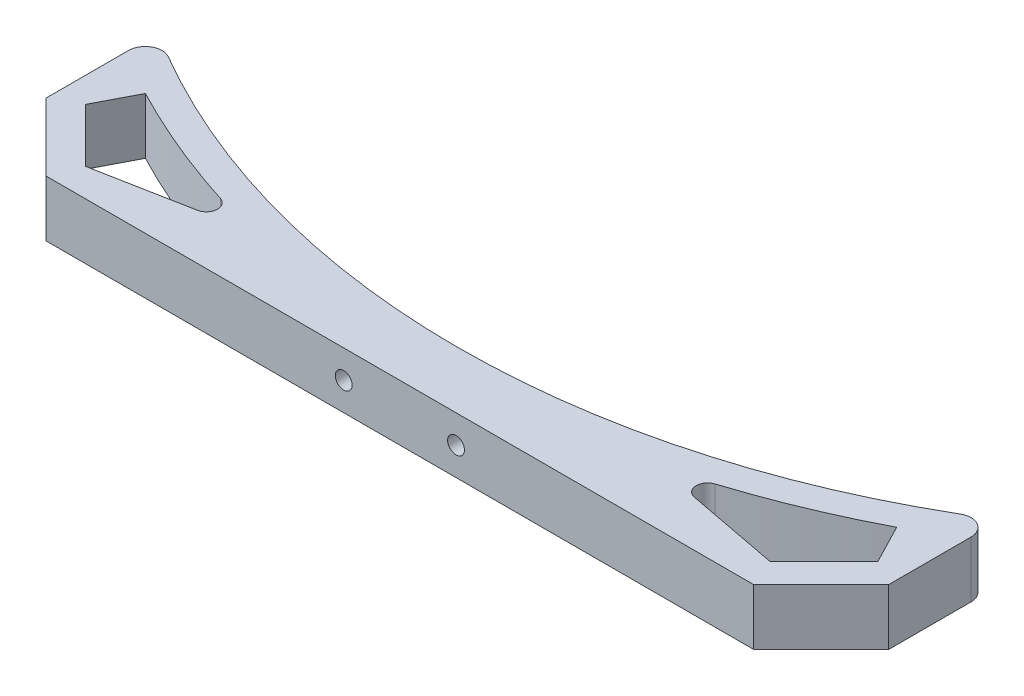
ISO-10303-21;
HEADER;
FILE_DESCRIPTION(('STEP AP214'),'2;1');
FILE_NAME('part.step','',(''),(''),'','','');
FILE_SCHEMA(('AUTOMOTIVE_DESIGN { 1 0 10303 214 1 1 1 1 }'));
ENDSEC;
DATA;
#1=APPLICATION_CONTEXT('core data for automotive mechanical design processes');
#2=APPLICATION_PROTOCOL_DEFINITION('international standard','automotive_design',2000,#1);
#3=PRODUCT_CONTEXT('',#1,'mechanical');
#4=PRODUCT('Part','Part','',(#3));
#5=PRODUCT_RELATED_PRODUCT_CATEGORY('part','',(#4));
#6=PRODUCT_DEFINITION_FORMATION('','',#4);
#7=PRODUCT_DEFINITION_CONTEXT('part definition',#1,'design');
#8=PRODUCT_DEFINITION('design','',#6,#7);
#9=PRODUCT_DEFINITION_SHAPE('','',#8);
#10=(LENGTH_UNIT() NAMED_UNIT(*) SI_UNIT(.MILLI.,.METRE.));
#11=(NAMED_UNIT(*) PLANE_ANGLE_UNIT() SI_UNIT($,.RADIAN.));
#12=(NAMED_UNIT(*) SI_UNIT($,.STERADIAN.) SOLID_ANGLE_UNIT());
#13=UNCERTAINTY_MEASURE_WITH_UNIT(LENGTH_MEASURE(1.E-05),#10,'distance_accuracy_value','');
#14=(GEOMETRIC_REPRESENTATION_CONTEXT(3) GLOBAL_UNCERTAINTY_ASSIGNED_CONTEXT((#13)) GLOBAL_UNIT_ASSIGNED_CONTEXT((#10,
#11,#12)) REPRESENTATION_CONTEXT('',''));
#15=CARTESIAN_POINT('',(0.,0.,0.));
#16=DIRECTION('',(0.,0.,1.));
#17=DIRECTION('',(1.,0.,0.));
#18=AXIS2_PLACEMENT_3D('',#15,#16,#17);
#19=CARTESIAN_POINT('',(0.,10.,-135.715904175369));
#20=DIRECTION('',(0.,1.,0.));
#21=DIRECTION('',(0.,0.,1.));
#22=AXIS2_PLACEMENT_3D('',#19,#20,#21);
#23=PLANE('',#22);
#24=DIRECTION('',(1.,0.,0.));
#25=VECTOR('',#24,1.);
#26=CARTESIAN_POINT('',(-75.,10.,14.51));
#27=LINE('',#26,#25);
#28=CARTESIAN_POINT('',(-62.99,10.,14.51));
#29=VERTEX_POINT('',#28);
#30=CARTESIAN_POINT('',(62.9899999999999,10.,14.51));
#31=VERTEX_POINT('',#30);
#32=EDGE_CURVE('E162',#29,#31,#27,.T.);
#33=ORIENTED_EDGE('',*,*,#32,.T.);
#34=DIRECTION('',(-0.707106781186549,0.,0.707106781186546));
#35=VECTOR('',#34,1.);
#36=CARTESIAN_POINT('',(106.607952087684,10.,-29.1079520876842));
#37=LINE('',#36,#35);
#38=CARTESIAN_POINT('',(75.,10.,2.49999999999994));
#39=VERTEX_POINT('',#38);
#40=EDGE_CURVE('E185',#31,#39,#37,.F.);
#41=ORIENTED_EDGE('',*,*,#40,.T.);
#42=DIRECTION('',(0.,0.,-1.));
#43=VECTOR('',#42,1.);
#44=CARTESIAN_POINT('',(75.,10.,17.5));
#45=LINE('',#44,#43);
#46=CARTESIAN_POINT('',(75.,10.,-12.16429552538));
#47=VERTEX_POINT('',#46);
#48=EDGE_CURVE('E187',#39,#47,#45,.T.);
#49=ORIENTED_EDGE('',*,*,#48,.T.);
#50=CARTESIAN_POINT('',(72.,10.,-12.16429552538));
#51=DIRECTION('',(0.,1.,0.));
#52=DIRECTION('',(0.,0.,1.));
#53=AXIS2_PLACEMENT_3D('',#50,#51,#52);
#54=CIRCLE('',#53,3.);
#55=CARTESIAN_POINT('',(70.4895104895105,10.,-14.7562873152399));
#56=VERTEX_POINT('',#55);
#57=EDGE_CURVE('E210',#47,#56,#54,.T.);
#58=ORIENTED_EDGE('',*,*,#57,.T.);
#59=CARTESIAN_POINT('',(0.,10.,-135.715904175369));
#60=DIRECTION('',(0.,-1.,0.));
#61=DIRECTION('',(0.,0.,1.));
#62=AXIS2_PLACEMENT_3D('',#59,#60,#61);
#63=CIRCLE('',#62,140.);
#64=CARTESIAN_POINT('',(-70.4895104895105,10.,-14.7562873152399));
#65=VERTEX_POINT('',#64);
#66=EDGE_CURVE('E274',#56,#65,#63,.T.);
#67=ORIENTED_EDGE('',*,*,#66,.T.);
#68=CARTESIAN_POINT('',(-72.,10.,-12.16429552538));
#69=DIRECTION('',(0.,1.,0.));
#70=DIRECTION('',(0.,0.,1.));
#71=AXIS2_PLACEMENT_3D('',#68,#69,#70);
#72=CIRCLE('',#71,3.);
#73=CARTESIAN_POINT('',(-75.,10.,-12.16429552538));
#74=VERTEX_POINT('',#73);
#75=EDGE_CURVE('E208',#65,#74,#72,.T.);
#76=ORIENTED_EDGE('',*,*,#75,.T.);
#77=DIRECTION('',(0.,0.,1.));
#78=VECTOR('',#77,1.);
#79=CARTESIAN_POINT('',(-75.,10.,17.5));
#80=LINE('',#79,#78);
#81=CARTESIAN_POINT('',(-75.,10.,2.49999999999994));
#82=VERTEX_POINT('',#81);
#83=EDGE_CURVE('E272',#74,#82,#80,.T.);
#84=ORIENTED_EDGE('',*,*,#83,.T.);
#85=DIRECTION('',(-0.707106781186546,0.,-0.707106781186549));
#86=VECTOR('',#85,1.);
#87=CARTESIAN_POINT('',(-106.607952087685,10.,-29.1079520876848));
#88=LINE('',#87,#86);
#89=EDGE_CURVE('E192',#82,#29,#88,.F.);
#90=ORIENTED_EDGE('',*,*,#89,.T.);
#91=EDGE_LOOP('',(#33,#41,#49,#58,#67,#76,#84,#90));
#92=FACE_BOUND('',#91,.T.);
#93=DIRECTION('',(0.461170886554333,0.,-0.88731133960673));
#94=VECTOR('',#93,1.);
#95=CARTESIAN_POINT('',(-55.535240746244,10.,-28.8638666798792));
#96=LINE('',#95,#94);
#97=CARTESIAN_POINT('',(-70.5,10.,-0.0710678118655203));
#98=VERTEX_POINT('',#97);
#99=CARTESIAN_POINT('',(-66.8697785503785,10.,-7.05575993239305));
#100=VERTEX_POINT('',#99);
#101=EDGE_CURVE('E334',#98,#100,#96,.T.);
#102=ORIENTED_EDGE('',*,*,#101,.T.);
#103=CARTESIAN_POINT('',(0.,10.,-135.715904175369));
#104=DIRECTION('',(0.,-1.,0.));
#105=DIRECTION('',(0.,0.,-1.));
#106=AXIS2_PLACEMENT_3D('',#103,#104,#105);
#107=CIRCLE('',#106,145.);
#108=CARTESIAN_POINT('',(-44.0052899238032,10.,2.44535833595166));
#109=VERTEX_POINT('',#108);
#110=EDGE_CURVE('E341',#109,#100,#107,.T.);
#111=ORIENTED_EDGE('',*,*,#110,.F.);
#112=CARTESIAN_POINT('',(-44.6122594399936,10.,4.35103092231472));
#113=DIRECTION('',(0.,1.,0.));
#114=DIRECTION('',(0.,0.,1.));
#115=AXIS2_PLACEMENT_3D('',#112,#113,#114);
#116=CIRCLE('',#115,2.);
#117=CARTESIAN_POINT('',(-44.2374589946152,10.,6.31559820956758));
#118=VERTEX_POINT('',#117);
#119=EDGE_CURVE('E11',#109,#118,#116,.F.);
#120=ORIENTED_EDGE('',*,*,#119,.T.);
#121=DIRECTION('',(0.98228364362644,0.,-0.187400222689211));
#122=VECTOR('',#121,1.);
#123=CARTESIAN_POINT('',(-0.390991983125823,10.,-2.04943742489839));
#124=LINE('',#123,#122);
#125=CARTESIAN_POINT('',(-60.9289321881345,10.,9.49999999999999));
#126=VERTEX_POINT('',#125);
#127=EDGE_CURVE('E354',#126,#118,#124,.T.);
#128=ORIENTED_EDGE('',*,*,#127,.F.);
#129=DIRECTION('',(-0.707106781186546,0.,-0.707106781186549));
#130=VECTOR('',#129,1.);
#131=CARTESIAN_POINT('',(-35.2144660940673,10.,35.2144660940672));
#132=LINE('',#131,#130);
#133=EDGE_CURVE('E351',#126,#98,#132,.T.);
#134=ORIENTED_EDGE('',*,*,#133,.T.);
#135=EDGE_LOOP('',(#102,#111,#120,#128,#134));
#136=FACE_BOUND('',#135,.T.);
#137=DIRECTION('',(-0.98228364362644,0.,-0.187400222689211));
#138=VECTOR('',#137,1.);
#139=CARTESIAN_POINT('',(0.390991983125823,10.,-2.04943742489839));
#140=LINE('',#139,#138);
#141=CARTESIAN_POINT('',(60.9289321881345,10.,9.5));
#142=VERTEX_POINT('',#141);
#143=CARTESIAN_POINT('',(44.2374589946152,10.,6.31559820956757));
#144=VERTEX_POINT('',#143);
#145=EDGE_CURVE('E315',#142,#144,#140,.T.);
#146=ORIENTED_EDGE('',*,*,#145,.T.);
#147=CARTESIAN_POINT('',(44.6122594399936,10.,4.35103092231472));
#148=DIRECTION('',(0.,1.,0.));
#149=DIRECTION('',(0.,0.,1.));
#150=AXIS2_PLACEMENT_3D('',#147,#148,#149);
#151=CIRCLE('',#150,2.);
#152=CARTESIAN_POINT('',(44.0052899238032,10.,2.44535833595166));
#153=VERTEX_POINT('',#152);
#154=EDGE_CURVE('E442',#144,#153,#151,.F.);
#155=ORIENTED_EDGE('',*,*,#154,.T.);
#156=CARTESIAN_POINT('',(0.,10.,-135.715904175369));
#157=DIRECTION('',(0.,-1.,0.));
#158=DIRECTION('',(0.,0.,-1.));
#159=AXIS2_PLACEMENT_3D('',#156,#157,#158);
#160=CIRCLE('',#159,145.);
#161=CARTESIAN_POINT('',(66.8697785503785,10.,-7.05575993239305));
#162=VERTEX_POINT('',#161);
#163=EDGE_CURVE('E327',#153,#162,#160,.F.);
#164=ORIENTED_EDGE('',*,*,#163,.T.);
#165=DIRECTION('',(-0.461170886554333,0.,-0.88731133960673));
#166=VECTOR('',#165,1.);
#167=CARTESIAN_POINT('',(55.535240746244,10.,-28.8638666798792));
#168=LINE('',#167,#166);
#169=CARTESIAN_POINT('',(70.5,10.,-0.0710678118655203));
#170=VERTEX_POINT('',#169);
#171=EDGE_CURVE('E324',#170,#162,#168,.T.);
#172=ORIENTED_EDGE('',*,*,#171,.F.);
#173=DIRECTION('',(0.707106781186546,0.,-0.707106781186549));
#174=VECTOR('',#173,1.);
#175=CARTESIAN_POINT('',(35.2144660940673,10.,35.2144660940672));
#176=LINE('',#175,#174);
#177=EDGE_CURVE('E307',#142,#170,#176,.T.);
#178=ORIENTED_EDGE('',*,*,#177,.F.);
#179=EDGE_LOOP('',(#146,#155,#164,#172,#178));
#180=FACE_BOUND('',#179,.T.);
#181=ADVANCED_FACE('F34',(#92,#136,#180),#23,.T.);
#182=CARTESIAN_POINT('',(0.,0.,-135.715904175369));
#183=DIRECTION('',(0.,1.,0.));
#184=DIRECTION('',(0.,0.,1.));
#185=AXIS2_PLACEMENT_3D('',#182,#183,#184);
#186=PLANE('',#185);
#187=DIRECTION('',(0.98228364362644,0.,-0.187400222689211));
#188=VECTOR('',#187,1.);
#189=CARTESIAN_POINT('',(-0.390991983125823,0.,-2.04943742489839));
#190=LINE('',#189,#188);
#191=CARTESIAN_POINT('',(-60.9289321881345,0.,9.49999999999999));
#192=VERTEX_POINT('',#191);
#193=CARTESIAN_POINT('',(-44.2374589946152,0.,6.31559820956758));
#194=VERTEX_POINT('',#193);
#195=EDGE_CURVE('E345',#192,#194,#190,.T.);
#196=ORIENTED_EDGE('',*,*,#195,.T.);
#197=CARTESIAN_POINT('',(-44.6122594399936,0.,4.35103092231472));
#198=DIRECTION('',(0.,1.,0.));
#199=DIRECTION('',(0.,0.,1.));
#200=AXIS2_PLACEMENT_3D('',#197,#198,#199);
#201=CIRCLE('',#200,2.);
#202=CARTESIAN_POINT('',(-44.0052899238032,0.,2.44535833595166));
#203=VERTEX_POINT('',#202);
#204=EDGE_CURVE('E43',#194,#203,#201,.T.);
#205=ORIENTED_EDGE('',*,*,#204,.T.);
#206=CARTESIAN_POINT('',(0.,0.,-135.715904175369));
#207=DIRECTION('',(0.,-1.,0.));
#208=DIRECTION('',(0.,0.,-1.));
#209=AXIS2_PLACEMENT_3D('',#206,#207,#208);
#210=CIRCLE('',#209,145.);
#211=CARTESIAN_POINT('',(-66.8697785503785,0.,-7.05575993239305));
#212=VERTEX_POINT('',#211);
#213=EDGE_CURVE('E311',#203,#212,#210,.T.);
#214=ORIENTED_EDGE('',*,*,#213,.T.);
#215=DIRECTION('',(0.461170886554333,0.,-0.88731133960673));
#216=VECTOR('',#215,1.);
#217=CARTESIAN_POINT('',(-55.535240746244,0.,-28.8638666798792));
#218=LINE('',#217,#216);
#219=CARTESIAN_POINT('',(-70.5,0.,-0.0710678118655203));
#220=VERTEX_POINT('',#219);
#221=EDGE_CURVE('E338',#220,#212,#218,.T.);
#222=ORIENTED_EDGE('',*,*,#221,.F.);
#223=DIRECTION('',(-0.707106781186546,0.,-0.707106781186549));
#224=VECTOR('',#223,1.);
#225=CARTESIAN_POINT('',(-35.2144660940673,0.,35.2144660940672));
#226=LINE('',#225,#224);
#227=EDGE_CURVE('E342',#192,#220,#226,.T.);
#228=ORIENTED_EDGE('',*,*,#227,.F.);
#229=EDGE_LOOP('',(#196,#205,#214,#222,#228));
#230=FACE_BOUND('',#229,.T.);
#231=DIRECTION('',(0.707106781186549,0.,-0.707106781186546));
#232=VECTOR('',#231,1.);
#233=CARTESIAN_POINT('',(75.,0.,2.49999999999994));
#234=LINE('',#233,#232);
#235=CARTESIAN_POINT('',(75.,0.,2.49999999999994));
#236=VERTEX_POINT('',#235);
#237=CARTESIAN_POINT('',(62.9899999999999,0.,14.51));
#238=VERTEX_POINT('',#237);
#239=EDGE_CURVE('E178',#236,#238,#234,.F.);
#240=ORIENTED_EDGE('',*,*,#239,.T.);
#241=DIRECTION('',(1.,0.,0.));
#242=VECTOR('',#241,1.);
#243=CARTESIAN_POINT('',(-75.,0.,14.51));
#244=LINE('',#243,#242);
#245=CARTESIAN_POINT('',(-62.99,0.,14.51));
#246=VERTEX_POINT('',#245);
#247=EDGE_CURVE('E50',#246,#238,#244,.T.);
#248=ORIENTED_EDGE('',*,*,#247,.F.);
#249=DIRECTION('',(0.707106781186546,0.,0.707106781186549));
#250=VECTOR('',#249,1.);
#251=CARTESIAN_POINT('',(-60.,0.,17.5));
#252=LINE('',#251,#250);
#253=CARTESIAN_POINT('',(-75.,0.,2.49999999999994));
#254=VERTEX_POINT('',#253);
#255=EDGE_CURVE('E175',#246,#254,#252,.F.);
#256=ORIENTED_EDGE('',*,*,#255,.T.);
#257=DIRECTION('',(0.,0.,1.));
#258=VECTOR('',#257,1.);
#259=CARTESIAN_POINT('',(-75.,0.,17.5));
#260=LINE('',#259,#258);
#261=CARTESIAN_POINT('',(-75.,0.,-12.16429552538));
#262=VERTEX_POINT('',#261);
#263=EDGE_CURVE('E282',#262,#254,#260,.T.);
#264=ORIENTED_EDGE('',*,*,#263,.F.);
#265=CARTESIAN_POINT('',(-72.,0.,-12.16429552538));
#266=DIRECTION('',(0.,1.,0.));
#267=DIRECTION('',(0.,0.,1.));
#268=AXIS2_PLACEMENT_3D('',#265,#266,#267);
#269=CIRCLE('',#268,3.);
#270=CARTESIAN_POINT('',(-70.4895104895105,0.,-14.7562873152399));
#271=VERTEX_POINT('',#270);
#272=EDGE_CURVE('E202',#262,#271,#269,.F.);
#273=ORIENTED_EDGE('',*,*,#272,.T.);
#274=CARTESIAN_POINT('',(0.,0.,-135.715904175369));
#275=DIRECTION('',(0.,-1.,0.));
#276=DIRECTION('',(0.,0.,1.));
#277=AXIS2_PLACEMENT_3D('',#274,#275,#276);
#278=CIRCLE('',#277,140.);
#279=CARTESIAN_POINT('',(70.4895104895105,0.,-14.7562873152399));
#280=VERTEX_POINT('',#279);
#281=EDGE_CURVE('E281',#280,#271,#278,.T.);
#282=ORIENTED_EDGE('',*,*,#281,.F.);
#283=CARTESIAN_POINT('',(72.,0.,-12.16429552538));
#284=DIRECTION('',(0.,1.,0.));
#285=DIRECTION('',(0.,0.,1.));
#286=AXIS2_PLACEMENT_3D('',#283,#284,#285);
#287=CIRCLE('',#286,3.);
#288=CARTESIAN_POINT('',(75.,0.,-12.16429552538));
#289=VERTEX_POINT('',#288);
#290=EDGE_CURVE('E204',#280,#289,#287,.F.);
#291=ORIENTED_EDGE('',*,*,#290,.T.);
#292=DIRECTION('',(0.,0.,-1.));
#293=VECTOR('',#292,1.);
#294=CARTESIAN_POINT('',(75.,0.,17.5));
#295=LINE('',#294,#293);
#296=EDGE_CURVE('E289',#236,#289,#295,.T.);
#297=ORIENTED_EDGE('',*,*,#296,.F.);
#298=EDGE_LOOP('',(#240,#248,#256,#264,#273,#282,#291,#297));
#299=FACE_BOUND('',#298,.T.);
#300=CARTESIAN_POINT('',(0.,0.,-135.715904175369));
#301=DIRECTION('',(0.,-1.,0.));
#302=DIRECTION('',(0.,0.,-1.));
#303=AXIS2_PLACEMENT_3D('',#300,#301,#302);
#304=CIRCLE('',#303,145.);
#305=CARTESIAN_POINT('',(44.0052899238032,0.,2.44535833595166));
#306=VERTEX_POINT('',#305);
#307=CARTESIAN_POINT('',(66.8697785503785,0.,-7.05575993239305));
#308=VERTEX_POINT('',#307);
#309=EDGE_CURVE('E319',#306,#308,#304,.F.);
#310=ORIENTED_EDGE('',*,*,#309,.F.);
#311=CARTESIAN_POINT('',(44.6122594399936,0.,4.35103092231472));
#312=DIRECTION('',(0.,1.,0.));
#313=DIRECTION('',(0.,0.,1.));
#314=AXIS2_PLACEMENT_3D('',#311,#312,#313);
#315=CIRCLE('',#314,2.);
#316=CARTESIAN_POINT('',(44.2374589946152,0.,6.31559820956757));
#317=VERTEX_POINT('',#316);
#318=EDGE_CURVE('E444',#306,#317,#315,.T.);
#319=ORIENTED_EDGE('',*,*,#318,.T.);
#320=DIRECTION('',(-0.98228364362644,0.,-0.187400222689211));
#321=VECTOR('',#320,1.);
#322=CARTESIAN_POINT('',(0.390991983125823,0.,-2.04943742489839));
#323=LINE('',#322,#321);
#324=CARTESIAN_POINT('',(60.9289321881345,0.,9.5));
#325=VERTEX_POINT('',#324);
#326=EDGE_CURVE('E167',#325,#317,#323,.T.);
#327=ORIENTED_EDGE('',*,*,#326,.F.);
#328=DIRECTION('',(0.707106781186546,0.,-0.707106781186549));
#329=VECTOR('',#328,1.);
#330=CARTESIAN_POINT('',(35.2144660940673,0.,35.2144660940672));
#331=LINE('',#330,#329);
#332=CARTESIAN_POINT('',(70.5,0.,-0.0710678118655203));
#333=VERTEX_POINT('',#332);
#334=EDGE_CURVE('E312',#325,#333,#331,.T.);
#335=ORIENTED_EDGE('',*,*,#334,.T.);
#336=DIRECTION('',(-0.461170886554333,0.,-0.88731133960673));
#337=VECTOR('',#336,1.);
#338=CARTESIAN_POINT('',(55.535240746244,0.,-28.8638666798792));
#339=LINE('',#338,#337);
#340=EDGE_CURVE('E316',#333,#308,#339,.T.);
#341=ORIENTED_EDGE('',*,*,#340,.T.);
#342=EDGE_LOOP('',(#310,#319,#327,#335,#341));
#343=FACE_BOUND('',#342,.T.);
#344=ADVANCED_FACE('F172',(#230,#299,#343),#186,.F.);
#345=CARTESIAN_POINT('',(0.,10.,-135.715904175369));
#346=DIRECTION('',(0.,-1.,0.));
#347=DIRECTION('',(0.,0.,-1.));
#348=AXIS2_PLACEMENT_3D('',#345,#346,#347);
#349=CYLINDRICAL_SURFACE('',#348,140.);
#350=CARTESIAN_POINT('',(-13.5,5.00000000000001,3.63168281486215));
#351=CARTESIAN_POINT('',(-13.4999912080504,5.19596537616986,3.63168403997652));
#352=CARTESIAN_POINT('',(-13.4834853283404,5.39207245478965,3.63328581793912));
#353=CARTESIAN_POINT('',(-13.4178836209151,5.77887023487255,3.63961757646016));
#354=CARTESIAN_POINT('',(-13.3687487270463,5.96955415754711,3.64435130682594));
#355=CARTESIAN_POINT('',(-13.2393321696686,6.33983253502211,3.65670534228213));
#356=CARTESIAN_POINT('',(-13.1590689415149,6.51943348073484,3.66432393878472));
#357=CARTESIAN_POINT('',(-12.9697335242531,6.86254527941343,3.68206930043388));
#358=CARTESIAN_POINT('',(-12.8606680780004,7.02605988605299,3.69219547849878));
#359=CARTESIAN_POINT('',(-12.6165348271643,7.33286756899341,3.71450163942883));
#360=CARTESIAN_POINT('',(-12.4814035294313,7.47610975608848,3.72668662811876));
#361=CARTESIAN_POINT('',(-12.1891472541654,7.7379055275742,3.75253729499346));
#362=CARTESIAN_POINT('',(-12.0320209588802,7.85645763168651,3.76620306188271));
#363=CARTESIAN_POINT('',(-11.6995298979716,8.06600206251543,3.79448578763923));
#364=CARTESIAN_POINT('',(-11.5240934676547,8.1568801950677,3.80910639331334));
#365=CARTESIAN_POINT('',(-11.1604729174222,8.30787837151101,3.83866252366499));
#366=CARTESIAN_POINT('',(-10.9722886259912,8.36799800147033,3.85359805257779));
#367=CARTESIAN_POINT('',(-10.5880337871691,8.45588609543274,3.88327467952904));
#368=CARTESIAN_POINT('',(-10.3919460285045,8.48357951584245,3.89801524880254));
#369=CARTESIAN_POINT('',(-9.99785497283968,8.50555885589948,3.92678959901189));
#370=CARTESIAN_POINT('',(-9.79985167951412,8.49984483961923,3.94082338130323));
#371=CARTESIAN_POINT('',(-9.40763288192424,8.4551475604721,3.96779236876799));
#372=CARTESIAN_POINT('',(-9.2134160046732,8.41617659532023,3.98072797807874));
#373=CARTESIAN_POINT('',(-8.83423915180435,8.30605142907714,4.00521926906441));
#374=CARTESIAN_POINT('',(-8.64927909511034,8.23489750991636,4.0167749628266));
#375=CARTESIAN_POINT('',(-8.29427244234662,8.06257205726752,4.03829663122031));
#376=CARTESIAN_POINT('',(-8.12419683996565,7.96146067095873,4.04826573027184));
#377=CARTESIAN_POINT('',(-7.80342036986761,7.73201791514151,4.06654280074938));
#378=CARTESIAN_POINT('',(-7.65271928195843,7.60368685502968,4.07485079105454));
#379=CARTESIAN_POINT('',(-7.37530820137397,7.32373533678215,4.08976141799173));
#380=CARTESIAN_POINT('',(-7.24854934055514,7.17216348704674,4.09636753854631));
#381=CARTESIAN_POINT('',(-7.02227046835415,6.84983779813776,4.10791566905127));
#382=CARTESIAN_POINT('',(-6.92275025876146,6.67908409855964,4.11285769111104));
#383=CARTESIAN_POINT('',(-6.75391510592607,6.32348799161533,4.12111453278243));
#384=CARTESIAN_POINT('',(-6.68456023513051,6.13866459056357,4.12443150408955));
#385=CARTESIAN_POINT('',(-6.57784758034712,5.75998007210143,4.12949188526525));
#386=CARTESIAN_POINT('',(-6.54048967524807,5.56611898890238,4.13123530108987));
#387=CARTESIAN_POINT('',(-6.49885219037749,5.17498717756873,4.13317649370789));
#388=CARTESIAN_POINT('',(-6.4945527500472,4.97771856798962,4.13337519851928));
#389=CARTESIAN_POINT('',(-6.51910257440242,4.58525960828838,4.13223291209577));
#390=CARTESIAN_POINT('',(-6.54795178757121,4.39006925493689,4.13089192325372));
#391=CARTESIAN_POINT('',(-6.63796849175915,4.00733361508926,4.12664794362067));
#392=CARTESIAN_POINT('',(-6.69913176595249,3.81978733451814,4.12374515663572));
#393=CARTESIAN_POINT('',(-6.85202631065582,3.45763340178619,4.11633659750162));
#394=CARTESIAN_POINT('',(-6.94375756818026,3.28302574412895,4.11183082603343));
#395=CARTESIAN_POINT('',(-7.15519378966768,2.95165555418349,4.10117048467879));
#396=CARTESIAN_POINT('',(-7.27490565476557,2.79489743851273,4.09501550797758));
#397=CARTESIAN_POINT('',(-7.53887116107331,2.50371031194336,4.08103013770461));
#398=CARTESIAN_POINT('',(-7.68312486309002,2.3692813563709,4.07319973998167));
#399=CARTESIAN_POINT('',(-7.99218122839567,2.12644551982601,4.05587039352188));
#400=CARTESIAN_POINT('',(-8.15699998337036,2.01805921310498,4.04637013575183));
#401=CARTESIAN_POINT('',(-8.50239900289802,1.83048690451343,4.02578289049937));
#402=CARTESIAN_POINT('',(-8.68297936136521,1.7513010766463,4.01469589356225));
#403=CARTESIAN_POINT('',(-9.05506450753296,1.62423256330734,3.99107697858833));
#404=CARTESIAN_POINT('',(-9.24658598691811,1.57639917461116,3.97854282133554));
#405=CARTESIAN_POINT('',(-9.63486142054237,1.51354727293576,3.95230013228493));
#406=CARTESIAN_POINT('',(-9.83161545126174,1.49852923986109,3.93859158331539));
#407=CARTESIAN_POINT('',(-10.225224012978,1.50170151709016,3.91032476939962));
#408=CARTESIAN_POINT('',(-10.4220778350951,1.519963980984,3.89576472462872));
#409=CARTESIAN_POINT('',(-10.8098924151433,1.58929953424413,3.86627255754678));
#410=CARTESIAN_POINT('',(-11.0008530855355,1.6403731107519,3.85134042971464));
#411=CARTESIAN_POINT('',(-11.3718085567502,1.77400035531263,3.82160576743997));
#412=CARTESIAN_POINT('',(-11.5517839553105,1.85660795346038,3.8068034997001));
#413=CARTESIAN_POINT('',(-11.895299599201,2.05096929624375,3.77793653478784));
#414=CARTESIAN_POINT('',(-12.0588404402253,2.16272198394547,3.76387181089095));
#415=CARTESIAN_POINT('',(-12.364763953045,2.41217671021978,3.73708512134034));
#416=CARTESIAN_POINT('',(-12.507156367307,2.54986673348779,3.72436253818879));
#417=CARTESIAN_POINT('',(-12.7668190563936,2.84739677301055,3.70082860420052));
#418=CARTESIAN_POINT('',(-12.8840834662202,3.00724194607852,3.69001769966156));
#419=CARTESIAN_POINT('',(-13.0897807418355,3.34406697551238,3.67085387141221));
#420=CARTESIAN_POINT('',(-13.1782864313229,3.52100205722503,3.66249474455093));
#421=CARTESIAN_POINT('',(-13.3242157215911,3.88719048085699,3.64862036617513));
#422=CARTESIAN_POINT('',(-13.3816775006337,4.07642837007979,3.64310162191335));
#423=CARTESIAN_POINT('',(-13.448460968038,4.38907926600559,3.63666849764985));
#424=CARTESIAN_POINT('',(-13.4677632564277,4.51043161183768,3.63480275909455));
#425=CARTESIAN_POINT('',(-13.4935355083843,4.75450410047806,3.63230953567711));
#426=CARTESIAN_POINT('',(-13.5000055083113,4.87722423940978,3.63168204730641));
#427=CARTESIAN_POINT('',(-13.5,5.00000000000001,3.63168281486215));
#428=B_SPLINE_CURVE_WITH_KNOTS('',3,(#350,#351,#352,#353,#354,#355,#356,#357,#358,#359,#360,
#361,#362,#363,#364,#365,#366,#367,#368,#369,#370,#371,#372,#373,#374,#375,#376,#377,#378,#379,
#380,#381,#382,#383,#384,#385,#386,#387,#388,#389,#390,#391,#392,#393,#394,#395,#396,#397,#398,
#399,#400,#401,#402,#403,#404,#405,#406,#407,#408,#409,#410,#411,#412,#413,#414,#415,#416,#417,
#418,#419,#420,#421,#422,#423,#424,#425,#426,#427),.UNSPECIFIED.,.T.,.F.,(4,2,2,2,2,2,2,2,2,2,2,
2,2,2,2,2,2,2,2,2,2,2,2,2,2,2,2,2,2,2,2,2,2,2,2,2,2,2,4),(0.,0.587446835243286,1.17559828155565,
1.76340193335396,2.35106809689268,2.94018424318111,3.52933569939462,4.1208862839476,
4.71244482906753,5.30536972205705,5.8982934778705,6.49099807799902,7.08369748599271,
7.6752148724746,8.26672553574382,8.85701551023205,9.44730118917725,10.0368031565971,
10.6263028926923,11.215448446895,11.8045930855007,12.3936608626153,12.9827283894892,
13.5719413575299,14.1611557854736,14.7508341861049,15.3405161005272,15.9311229868098,
16.5217385102995,17.113636038088,17.70554235389,18.2984655277285,18.8913672024573,
19.4839948917175,20.076760752849,20.6680136801057,21.2585378108773,21.6265846453535,
21.9946304369775),.UNSPECIFIED.);
#429=CARTESIAN_POINT('',(-13.5,5.00000000000001,3.63168281486215));
#430=VERTEX_POINT('',#429);
#431=EDGE_CURVE('E223',#430,#430,#428,.T.);
#432=ORIENTED_EDGE('',*,*,#431,.F.);
#433=EDGE_LOOP('',(#432));
#434=FACE_BOUND('',#433,.T.);
#435=ORIENTED_EDGE('',*,*,#66,.F.);
#436=DIRECTION('',(0.,-1.,0.));
#437=VECTOR('',#436,1.);
#438=CARTESIAN_POINT('',(70.4895104895105,10.,-14.7562873152399));
#439=LINE('',#438,#437);
#440=EDGE_CURVE('E199',#56,#280,#439,.T.);
#441=ORIENTED_EDGE('',*,*,#440,.T.);
#442=ORIENTED_EDGE('',*,*,#281,.T.);
#443=DIRECTION('',(0.,-1.,0.));
#444=VECTOR('',#443,1.);
#445=CARTESIAN_POINT('',(-70.4895104895105,10.,-14.7562873152399));
#446=LINE('',#445,#444);
#447=EDGE_CURVE('E197',#271,#65,#446,.F.);
#448=ORIENTED_EDGE('',*,*,#447,.T.);
#449=EDGE_LOOP('',(#435,#441,#442,#448));
#450=FACE_BOUND('',#449,.T.);
#451=CARTESIAN_POINT('',(6.5,5.00000000000001,4.13312156310383));
#452=CARTESIAN_POINT('',(6.50000871010711,5.19641555402254,4.13312153105956));
#453=CARTESIAN_POINT('',(6.51658956255637,5.39297275448231,4.13235355765374));
#454=CARTESIAN_POINT('',(6.58250037125347,5.78067131979564,4.12926640763352));
#455=CARTESIAN_POINT('',(6.63186952149902,5.9718059171917,4.1269453745203));
#456=CARTESIAN_POINT('',(6.76194105819122,6.34298594585757,4.12071609363657));
#457=CARTESIAN_POINT('',(6.84262816034443,6.52303673684046,4.11680862006366));
#458=CARTESIAN_POINT('',(7.03300927126215,6.86697552420589,4.10736219984652));
#459=CARTESIAN_POINT('',(7.14269610649077,7.03086750397619,4.10182365663425));
#460=CARTESIAN_POINT('',(7.38800213464328,7.3379696725449,4.0890759556814));
#461=CARTESIAN_POINT('',(7.52363171961951,7.48117153288173,4.08186612821777));
#462=CARTESIAN_POINT('',(7.8169280549813,7.74277494330794,4.06577259438927));
#463=CARTESIAN_POINT('',(7.97459573305431,7.86117544886664,4.05688881755447));
#464=CARTESIAN_POINT('',(8.30763737166189,8.06994664986098,4.03748923481823));
#465=CARTESIAN_POINT('',(8.48302881090053,8.1602893107103,4.02697181226066));
#466=CARTESIAN_POINT('',(8.84639393728655,8.31026067689648,4.00443943346604));
#467=CARTESIAN_POINT('',(9.03436771295422,8.36988916612486,3.99242446669284));
#468=CARTESIAN_POINT('',(9.41791663035821,8.45686528769062,3.9670934662581));
#469=CARTESIAN_POINT('',(9.61350496550182,8.48415405795737,3.95377510780392));
#470=CARTESIAN_POINT('',(10.0064195567188,8.50551994239697,3.9261752659031));
#471=CARTESIAN_POINT('',(10.2037458335876,8.49959665862997,3.9118937709184));
#472=CARTESIAN_POINT('',(10.594994819886,8.45468357379526,3.88275147372217));
#473=CARTESIAN_POINT('',(10.7889091557189,8.41562159154964,3.86788947454704));
#474=CARTESIAN_POINT('',(11.1674079878245,8.30545148005904,3.83811784557162));
#475=CARTESIAN_POINT('',(11.351992371832,8.2343429653076,3.82320821520048));
#476=CARTESIAN_POINT('',(11.7068260059847,8.0619758153167,3.79388756226642));
#477=CARTESIAN_POINT('',(11.8770576087722,7.9606807384664,3.77947716599104));
#478=CARTESIAN_POINT('',(12.1980920457117,7.73081777190536,3.75177148030952));
#479=CARTESIAN_POINT('',(12.3488949427974,7.60224997054045,3.73847618729137));
#480=CARTESIAN_POINT('',(12.6265835185698,7.3216320487219,3.71360792537328));
#481=CARTESIAN_POINT('',(12.7534982551686,7.16961087250715,3.70203286760956));
#482=CARTESIAN_POINT('',(12.9799774073145,6.84626472663718,3.68113009841567));
#483=CARTESIAN_POINT('',(13.0795423656666,6.67494014018762,3.67180234238425));
#484=CARTESIAN_POINT('',(13.2481134558006,6.31851477375096,3.65588159148653));
#485=CARTESIAN_POINT('',(13.3172299075196,6.13346661307845,3.64927872947544));
#486=CARTESIAN_POINT('',(13.4234142374219,5.75431422997192,3.63909150535891));
#487=CARTESIAN_POINT('',(13.4604829167212,5.56021023403952,3.63550706780028));
#488=CARTESIAN_POINT('',(13.501403642908,5.16926636546475,3.63154836294002));
#489=CARTESIAN_POINT('',(13.5053844925999,4.97244009206313,3.63116164772005));
#490=CARTESIAN_POINT('',(13.4803518090434,4.58091875004487,3.63358548137466));
#491=CARTESIAN_POINT('',(13.4513386470663,4.38622365747161,3.63639599427184));
#492=CARTESIAN_POINT('',(13.3612245992547,4.00474493347256,3.64506489817321));
#493=CARTESIAN_POINT('',(13.30016492789,3.81795147255121,3.65091937429804));
#494=CARTESIAN_POINT('',(13.1477516863093,3.45727856718434,3.66538026283648));
#495=CARTESIAN_POINT('',(13.0563978142276,3.28339925144257,3.67398670267193));
#496=CARTESIAN_POINT('',(12.8457741713507,2.95304311545799,3.69355481364649));
#497=CARTESIAN_POINT('',(12.7264403551646,2.79660745403176,3.70452188341496));
#498=CARTESIAN_POINT('',(12.463376682999,2.50596781421435,3.72828408184799));
#499=CARTESIAN_POINT('',(12.3196462640576,2.37176434898177,3.74107925269567));
#500=CARTESIAN_POINT('',(12.0112133070675,2.12881240654595,3.76798296335521));
#501=CARTESIAN_POINT('',(11.8464265889982,2.02017137004637,3.78209671015822));
#502=CARTESIAN_POINT('',(11.5010088157529,1.83209114278968,3.81099931151262));
#503=CARTESIAN_POINT('',(11.3203774791502,1.75265247084523,3.82578817805301));
#504=CARTESIAN_POINT('',(10.9477843028211,1.62500334553763,3.85551489915956));
#505=CARTESIAN_POINT('',(10.7557894114156,1.57688941677141,3.87045307156144));
#506=CARTESIAN_POINT('',(10.3664089181631,1.51364816498666,3.89991037750473));
#507=CARTESIAN_POINT('',(10.1690232820445,1.49852105173089,3.91442950838089));
#508=CARTESIAN_POINT('',(9.77437537192758,1.50170778816298,3.9426105579555));
#509=CARTESIAN_POINT('',(9.57711318449355,1.52003567801119,3.9562721142641));
#510=CARTESIAN_POINT('',(9.18841543984785,1.58967547298593,3.98238135129411));
#511=CARTESIAN_POINT('',(8.99697984881243,1.64098718660111,3.99482903906304));
#512=CARTESIAN_POINT('',(8.62571868207399,1.7750597584496,4.01824178403752));
#513=CARTESIAN_POINT('',(8.44587450410331,1.85776868114966,4.02920924935183));
#514=CARTESIAN_POINT('',(8.10260968989004,2.05231845895205,4.04953259596159));
#515=CARTESIAN_POINT('',(7.93918822683272,2.16415784643854,4.05888855840639));
#516=CARTESIAN_POINT('',(7.63380421856972,2.41351753202369,4.07589964023333));
#517=CARTESIAN_POINT('',(7.49179360306678,2.55097870448572,4.08355858838085));
#518=CARTESIAN_POINT('',(7.23282311109649,2.84789847751433,4.09719655302799));
#519=CARTESIAN_POINT('',(7.11586922443598,3.00736232287184,4.10317516795051));
#520=CARTESIAN_POINT('',(6.9105310344341,3.34351365345064,4.1134745419833));
#521=CARTESIAN_POINT('',(6.82211517500621,3.52018183143936,4.11779713324715));
#522=CARTESIAN_POINT('',(6.67628723024303,3.88574244236924,4.12483584503929));
#523=CARTESIAN_POINT('',(6.61883798116904,4.07461991625723,4.1275538915932));
#524=CARTESIAN_POINT('',(6.55185038273954,4.38724761547519,4.13070419771015));
#525=CARTESIAN_POINT('',(6.53243099792527,4.5089646853881,4.13161105649069));
#526=CARTESIAN_POINT('',(6.50650307855179,4.75376927825333,4.13281974911983));
#527=CARTESIAN_POINT('',(6.49999453917761,4.87685680069453,4.13312158319406));
#528=CARTESIAN_POINT('',(6.5,5.00000000000001,4.13312156310383));
#529=B_SPLINE_CURVE_WITH_KNOTS('',3,(#451,#452,#453,#454,#455,#456,#457,#458,#459,#460,#461,
#462,#463,#464,#465,#466,#467,#468,#469,#470,#471,#472,#473,#474,#475,#476,#477,#478,#479,#480,
#481,#482,#483,#484,#485,#486,#487,#488,#489,#490,#491,#492,#493,#494,#495,#496,#497,#498,#499,
#500,#501,#502,#503,#504,#505,#506,#507,#508,#509,#510,#511,#512,#513,#514,#515,#516,#517,#518,
#519,#520,#521,#522,#523,#524,#525,#526,#527,#528),.UNSPECIFIED.,.T.,.F.,(4,2,2,2,2,2,2,2,2,2,2,
2,2,2,2,2,2,2,2,2,2,2,2,2,2,2,2,2,2,2,2,2,2,2,2,2,2,2,4),(0.,0.588797132497117,1.17829936257448,
1.76751425525032,2.35658353258766,2.9458892732033,3.53521982795613,4.12513734427113,
4.71505901125778,5.306052763613,5.89705359714609,6.48934503621712,7.08164360049805,
7.67466011202656,8.26767470259834,8.85996321247795,9.45223996648983,10.0423527924421,
10.6324508665888,11.2202507526207,11.80804402439,12.3950831909873,12.9821282072946,
13.5705303040838,14.1589459803479,14.7497923119344,15.3406491400593,15.9333181337431,
16.525990896191,17.1189124445628,17.7118305503326,18.3037721274184,18.895683887786,
19.4862462752346,20.0769496793924,20.6669976542449,21.2563359133974,21.6254838153495,
21.9946315796313),.UNSPECIFIED.);
#530=CARTESIAN_POINT('',(6.5,5.00000000000001,4.13312156310383));
#531=VERTEX_POINT('',#530);
#532=EDGE_CURVE('E230',#531,#531,#529,.T.);
#533=ORIENTED_EDGE('',*,*,#532,.F.);
#534=EDGE_LOOP('',(#533));
#535=FACE_BOUND('',#534,.T.);
#536=ADVANCED_FACE('F235',(#434,#450,#535),#349,.F.);
#537=CARTESIAN_POINT('',(-75.,10.,17.5));
#538=DIRECTION('',(1.,0.,0.));
#539=DIRECTION('',(0.,0.,-1.));
#540=AXIS2_PLACEMENT_3D('',#537,#538,#539);
#541=PLANE('',#540);
#542=ORIENTED_EDGE('',*,*,#83,.F.);
#543=DIRECTION('',(0.,-1.,0.));
#544=VECTOR('',#543,1.);
#545=CARTESIAN_POINT('',(-75.,10.,-12.16429552538));
#546=LINE('',#545,#544);
#547=EDGE_CURVE('E212',#74,#262,#546,.T.);
#548=ORIENTED_EDGE('',*,*,#547,.T.);
#549=ORIENTED_EDGE('',*,*,#263,.T.);
#550=DIRECTION('',(0.,1.,0.));
#551=VECTOR('',#550,1.);
#552=CARTESIAN_POINT('',(-75.,10.,2.49999999999994));
#553=LINE('',#552,#551);
#554=EDGE_CURVE('E183',#254,#82,#553,.T.);
#555=ORIENTED_EDGE('',*,*,#554,.T.);
#556=EDGE_LOOP('',(#542,#548,#549,#555));
#557=FACE_BOUND('',#556,.T.);
#558=ADVANCED_FACE('F263',(#557),#541,.F.);
#559=CARTESIAN_POINT('',(75.,10.,17.5));
#560=DIRECTION('',(-1.,0.,0.));
#561=DIRECTION('',(0.,0.,1.));
#562=AXIS2_PLACEMENT_3D('',#559,#560,#561);
#563=PLANE('',#562);
#564=ORIENTED_EDGE('',*,*,#296,.T.);
#565=DIRECTION('',(0.,-1.,0.));
#566=VECTOR('',#565,1.);
#567=CARTESIAN_POINT('',(75.,10.,-12.16429552538));
#568=LINE('',#567,#566);
#569=EDGE_CURVE('E206',#289,#47,#568,.F.);
#570=ORIENTED_EDGE('',*,*,#569,.T.);
#571=ORIENTED_EDGE('',*,*,#48,.F.);
#572=DIRECTION('',(0.,-1.,0.));
#573=VECTOR('',#572,1.);
#574=CARTESIAN_POINT('',(75.,10.,2.49999999999994));
#575=LINE('',#574,#573);
#576=EDGE_CURVE('E194',#39,#236,#575,.T.);
#577=ORIENTED_EDGE('',*,*,#576,.T.);
#578=EDGE_LOOP('',(#564,#570,#571,#577));
#579=FACE_BOUND('',#578,.T.);
#580=ADVANCED_FACE('F261',(#579),#563,.F.);
#581=CARTESIAN_POINT('',(-60.,10.,17.5));
#582=DIRECTION('',(0.707106781186549,0.,-0.707106781186546));
#583=DIRECTION('',(0.,-1.,0.));
#584=AXIS2_PLACEMENT_3D('',#581,#582,#583);
#585=PLANE('',#584);
#586=DIRECTION('',(0.,1.,0.));
#587=VECTOR('',#586,1.);
#588=CARTESIAN_POINT('',(-62.99,10.,14.51));
#589=LINE('',#588,#587);
#590=EDGE_CURVE('E158',#29,#246,#589,.F.);
#591=ORIENTED_EDGE('',*,*,#590,.F.);
#592=ORIENTED_EDGE('',*,*,#89,.F.);
#593=ORIENTED_EDGE('',*,*,#554,.F.);
#594=ORIENTED_EDGE('',*,*,#255,.F.);
#595=EDGE_LOOP('',(#591,#592,#593,#594));
#596=FACE_BOUND('',#595,.T.);
#597=ADVANCED_FACE('F181',(#596),#585,.F.);
#598=CARTESIAN_POINT('',(75.,10.,2.49999999999994));
#599=DIRECTION('',(-0.707106781186546,0.,-0.707106781186549));
#600=DIRECTION('',(0.,-1.,0.));
#601=AXIS2_PLACEMENT_3D('',#598,#599,#600);
#602=PLANE('',#601);
#603=DIRECTION('',(0.,-1.,0.));
#604=VECTOR('',#603,1.);
#605=CARTESIAN_POINT('',(62.9899999999999,10.,14.51));
#606=LINE('',#605,#604);
#607=EDGE_CURVE('E168',#238,#31,#606,.F.);
#608=ORIENTED_EDGE('',*,*,#607,.F.);
#609=ORIENTED_EDGE('',*,*,#239,.F.);
#610=ORIENTED_EDGE('',*,*,#576,.F.);
#611=ORIENTED_EDGE('',*,*,#40,.F.);
#612=EDGE_LOOP('',(#608,#609,#610,#611));
#613=FACE_BOUND('',#612,.T.);
#614=ADVANCED_FACE('F473',(#613),#602,.F.);
#615=CARTESIAN_POINT('',(72.,10.,-12.16429552538));
#616=DIRECTION('',(0.,-1.,0.));
#617=DIRECTION('',(0.,0.,-1.));
#618=AXIS2_PLACEMENT_3D('',#615,#616,#617);
#619=CYLINDRICAL_SURFACE('',#618,3.);
#620=ORIENTED_EDGE('',*,*,#57,.F.);
#621=ORIENTED_EDGE('',*,*,#569,.F.);
#622=ORIENTED_EDGE('',*,*,#290,.F.);
#623=ORIENTED_EDGE('',*,*,#440,.F.);
#624=EDGE_LOOP('',(#620,#621,#622,#623));
#625=FACE_BOUND('',#624,.T.);
#626=ADVANCED_FACE('F470',(#625),#619,.T.);
#627=CARTESIAN_POINT('',(-72.,10.,-12.16429552538));
#628=DIRECTION('',(0.,-1.,0.));
#629=DIRECTION('',(0.,0.,-1.));
#630=AXIS2_PLACEMENT_3D('',#627,#628,#629);
#631=CYLINDRICAL_SURFACE('',#630,3.);
#632=ORIENTED_EDGE('',*,*,#75,.F.);
#633=ORIENTED_EDGE('',*,*,#447,.F.);
#634=ORIENTED_EDGE('',*,*,#272,.F.);
#635=ORIENTED_EDGE('',*,*,#547,.F.);
#636=EDGE_LOOP('',(#632,#633,#634,#635));
#637=FACE_BOUND('',#636,.T.);
#638=ADVANCED_FACE('F253',(#637),#631,.T.);
#639=CARTESIAN_POINT('',(10.,5.00000000000001,17.5));
#640=DIRECTION('',(0.,0.,-1.));
#641=DIRECTION('',(-1.,0.,0.));
#642=AXIS2_PLACEMENT_3D('',#639,#640,#641);
#643=CYLINDRICAL_SURFACE('',#642,1.5);
#644=CARTESIAN_POINT('',(10.,5.00000000000001,14.51));
#645=DIRECTION('',(0.,0.,-1.));
#646=DIRECTION('',(-1.,0.,0.));
#647=AXIS2_PLACEMENT_3D('',#644,#645,#646);
#648=CIRCLE('',#647,1.5);
#649=CARTESIAN_POINT('',(8.5,5.00000000000001,14.51));
#650=VERTEX_POINT('',#649);
#651=EDGE_CURVE('E359',#650,#650,#648,.T.);
#652=ORIENTED_EDGE('',*,*,#651,.F.);
#653=EDGE_LOOP('',(#652));
#654=FACE_BOUND('',#653,.T.);
#655=CARTESIAN_POINT('',(10.,5.00000000000001,10.));
#656=DIRECTION('',(0.,0.,1.));
#657=DIRECTION('',(1.,0.,0.));
#658=AXIS2_PLACEMENT_3D('',#655,#656,#657);
#659=CIRCLE('',#658,1.5);
#660=CARTESIAN_POINT('',(11.5,5.00000000000001,10.));
#661=VERTEX_POINT('',#660);
#662=EDGE_CURVE('E219',#661,#661,#659,.T.);
#663=ORIENTED_EDGE('',*,*,#662,.F.);
#664=EDGE_LOOP('',(#663));
#665=FACE_BOUND('',#664,.T.);
#666=ADVANCED_FACE('F249',(#654,#665),#643,.F.);
#667=CARTESIAN_POINT('',(-10.,5.00000000000001,17.5));
#668=DIRECTION('',(0.,0.,-1.));
#669=DIRECTION('',(-1.,0.,0.));
#670=AXIS2_PLACEMENT_3D('',#667,#668,#669);
#671=CYLINDRICAL_SURFACE('',#670,1.5);
#672=CARTESIAN_POINT('',(-10.,5.00000000000001,14.51));
#673=DIRECTION('',(0.,0.,-1.));
#674=DIRECTION('',(-1.,0.,0.));
#675=AXIS2_PLACEMENT_3D('',#672,#673,#674);
#676=CIRCLE('',#675,1.5);
#677=CARTESIAN_POINT('',(-11.5,5.00000000000001,14.51));
#678=VERTEX_POINT('',#677);
#679=EDGE_CURVE('E38',#678,#678,#676,.T.);
#680=ORIENTED_EDGE('',*,*,#679,.F.);
#681=EDGE_LOOP('',(#680));
#682=FACE_BOUND('',#681,.T.);
#683=CARTESIAN_POINT('',(-10.,5.00000000000001,10.));
#684=DIRECTION('',(0.,0.,1.));
#685=DIRECTION('',(1.,0.,0.));
#686=AXIS2_PLACEMENT_3D('',#683,#684,#685);
#687=CIRCLE('',#686,1.5);
#688=CARTESIAN_POINT('',(-8.5,5.00000000000001,10.));
#689=VERTEX_POINT('',#688);
#690=EDGE_CURVE('E216',#689,#689,#687,.T.);
#691=ORIENTED_EDGE('',*,*,#690,.F.);
#692=EDGE_LOOP('',(#691));
#693=FACE_BOUND('',#692,.T.);
#694=ADVANCED_FACE('F245',(#682,#693),#671,.F.);
#695=CARTESIAN_POINT('',(-10.,5.00000000000001,10.));
#696=DIRECTION('',(0.,0.,-1.));
#697=DIRECTION('',(-1.,0.,0.));
#698=AXIS2_PLACEMENT_3D('',#695,#696,#697);
#699=CYLINDRICAL_SURFACE('',#698,3.5);
#700=CARTESIAN_POINT('',(-10.,5.00000000000001,10.));
#701=DIRECTION('',(0.,0.,1.));
#702=DIRECTION('',(1.,0.,0.));
#703=AXIS2_PLACEMENT_3D('',#700,#701,#702);
#704=CIRCLE('',#703,3.5);
#705=CARTESIAN_POINT('',(-6.5,5.00000000000001,10.));
#706=VERTEX_POINT('',#705);
#707=EDGE_CURVE('E297',#706,#706,#704,.T.);
#708=ORIENTED_EDGE('',*,*,#707,.T.);
#709=EDGE_LOOP('',(#708));
#710=FACE_BOUND('',#709,.T.);
#711=ORIENTED_EDGE('',*,*,#431,.T.);
#712=EDGE_LOOP('',(#711));
#713=FACE_BOUND('',#712,.T.);
#714=ADVANCED_FACE('F239',(#710,#713),#699,.F.);
#715=CARTESIAN_POINT('',(-10.,5.00000000000001,10.));
#716=DIRECTION('',(0.,0.,1.));
#717=DIRECTION('',(1.,0.,0.));
#718=AXIS2_PLACEMENT_3D('',#715,#716,#717);
#719=PLANE('',#718);
#720=ORIENTED_EDGE('',*,*,#690,.T.);
#721=EDGE_LOOP('',(#720));
#722=FACE_BOUND('',#721,.T.);
#723=ORIENTED_EDGE('',*,*,#707,.F.);
#724=EDGE_LOOP('',(#723));
#725=FACE_BOUND('',#724,.T.);
#726=ADVANCED_FACE('F244',(#722,#725),#719,.F.);
#727=CARTESIAN_POINT('',(10.,5.00000000000001,10.));
#728=DIRECTION('',(0.,0.,-1.));
#729=DIRECTION('',(-1.,0.,0.));
#730=AXIS2_PLACEMENT_3D('',#727,#728,#729);
#731=CYLINDRICAL_SURFACE('',#730,3.5);
#732=CARTESIAN_POINT('',(10.,5.00000000000001,10.));
#733=DIRECTION('',(0.,0.,1.));
#734=DIRECTION('',(1.,0.,0.));
#735=AXIS2_PLACEMENT_3D('',#732,#733,#734);
#736=CIRCLE('',#735,3.5);
#737=CARTESIAN_POINT('',(13.5,5.00000000000001,10.));
#738=VERTEX_POINT('',#737);
#739=EDGE_CURVE('E220',#738,#738,#736,.T.);
#740=ORIENTED_EDGE('',*,*,#739,.T.);
#741=EDGE_LOOP('',(#740));
#742=FACE_BOUND('',#741,.T.);
#743=ORIENTED_EDGE('',*,*,#532,.T.);
#744=EDGE_LOOP('',(#743));
#745=FACE_BOUND('',#744,.T.);
#746=ADVANCED_FACE('F371',(#742,#745),#731,.F.);
#747=CARTESIAN_POINT('',(10.,5.00000000000001,10.));
#748=DIRECTION('',(0.,0.,1.));
#749=DIRECTION('',(1.,0.,0.));
#750=AXIS2_PLACEMENT_3D('',#747,#748,#749);
#751=PLANE('',#750);
#752=ORIENTED_EDGE('',*,*,#662,.T.);
#753=EDGE_LOOP('',(#752));
#754=FACE_BOUND('',#753,.T.);
#755=ORIENTED_EDGE('',*,*,#739,.F.);
#756=EDGE_LOOP('',(#755));
#757=FACE_BOUND('',#756,.T.);
#758=ADVANCED_FACE('F378',(#754,#757),#751,.F.);
#759=CARTESIAN_POINT('',(0.390991983125823,10.,-2.04943742489839));
#760=DIRECTION('',(-0.187400222689211,0.,0.98228364362644));
#761=DIRECTION('',(0.98228364362644,0.,0.187400222689211));
#762=AXIS2_PLACEMENT_3D('',#759,#760,#761);
#763=PLANE('',#762);
#764=ORIENTED_EDGE('',*,*,#326,.T.);
#765=DIRECTION('',(0.,1.,0.));
#766=VECTOR('',#765,1.);
#767=CARTESIAN_POINT('',(44.2374589946152,10.,6.31559820956757));
#768=LINE('',#767,#766);
#769=EDGE_CURVE('E450',#317,#144,#768,.T.);
#770=ORIENTED_EDGE('',*,*,#769,.T.);
#771=ORIENTED_EDGE('',*,*,#145,.F.);
#772=DIRECTION('',(0.,-1.,0.));
#773=VECTOR('',#772,1.);
#774=CARTESIAN_POINT('',(60.9289321881345,10.,9.5));
#775=LINE('',#774,#773);
#776=EDGE_CURVE('E309',#142,#325,#775,.T.);
#777=ORIENTED_EDGE('',*,*,#776,.T.);
#778=EDGE_LOOP('',(#764,#770,#771,#777));
#779=FACE_BOUND('',#778,.T.);
#780=ADVANCED_FACE('F383',(#779),#763,.F.);
#781=CARTESIAN_POINT('',(35.2144660940673,10.,35.2144660940672));
#782=DIRECTION('',(-0.707106781186549,0.,-0.707106781186546));
#783=DIRECTION('',(-0.707106781186546,0.,0.707106781186549));
#784=AXIS2_PLACEMENT_3D('',#781,#782,#783);
#785=PLANE('',#784);
#786=ORIENTED_EDGE('',*,*,#334,.F.);
#787=ORIENTED_EDGE('',*,*,#776,.F.);
#788=ORIENTED_EDGE('',*,*,#177,.T.);
#789=DIRECTION('',(0.,-1.,0.));
#790=VECTOR('',#789,1.);
#791=CARTESIAN_POINT('',(70.5,10.,-0.0710678118655203));
#792=LINE('',#791,#790);
#793=EDGE_CURVE('E306',#170,#333,#792,.T.);
#794=ORIENTED_EDGE('',*,*,#793,.T.);
#795=EDGE_LOOP('',(#786,#787,#788,#794));
#796=FACE_BOUND('',#795,.T.);
#797=ADVANCED_FACE('F391',(#796),#785,.T.);
#798=CARTESIAN_POINT('',(55.535240746244,10.,-28.8638666798792));
#799=DIRECTION('',(-0.88731133960673,0.,0.461170886554333));
#800=DIRECTION('',(0.461170886554333,0.,0.887311339606731));
#801=AXIS2_PLACEMENT_3D('',#798,#799,#800);
#802=PLANE('',#801);
#803=ORIENTED_EDGE('',*,*,#340,.F.);
#804=ORIENTED_EDGE('',*,*,#793,.F.);
#805=ORIENTED_EDGE('',*,*,#171,.T.);
#806=DIRECTION('',(0.,-1.,0.));
#807=VECTOR('',#806,1.);
#808=CARTESIAN_POINT('',(66.8697785503785,10.,-7.05575993239305));
#809=LINE('',#808,#807);
#810=EDGE_CURVE('E303',#162,#308,#809,.T.);
#811=ORIENTED_EDGE('',*,*,#810,.T.);
#812=EDGE_LOOP('',(#803,#804,#805,#811));
#813=FACE_BOUND('',#812,.T.);
#814=ADVANCED_FACE('F397',(#813),#802,.T.);
#815=CARTESIAN_POINT('',(0.,10.,-135.715904175369));
#816=DIRECTION('',(0.,-1.,0.));
#817=DIRECTION('',(0.,0.,-1.));
#818=AXIS2_PLACEMENT_3D('',#815,#816,#817);
#819=CYLINDRICAL_SURFACE('',#818,145.);
#820=ORIENTED_EDGE('',*,*,#163,.F.);
#821=DIRECTION('',(0.,-1.,0.));
#822=VECTOR('',#821,1.);
#823=CARTESIAN_POINT('',(44.0052899238032,10.,2.44535833595166));
#824=LINE('',#823,#822);
#825=EDGE_CURVE('E215',#153,#306,#824,.T.);
#826=ORIENTED_EDGE('',*,*,#825,.T.);
#827=ORIENTED_EDGE('',*,*,#309,.T.);
#828=ORIENTED_EDGE('',*,*,#810,.F.);
#829=EDGE_LOOP('',(#820,#826,#827,#828));
#830=FACE_BOUND('',#829,.T.);
#831=ADVANCED_FACE('F393',(#830),#819,.T.);
#832=CARTESIAN_POINT('',(0.,10.,-135.715904175369));
#833=DIRECTION('',(0.,-1.,0.));
#834=DIRECTION('',(0.,0.,-1.));
#835=AXIS2_PLACEMENT_3D('',#832,#833,#834);
#836=CYLINDRICAL_SURFACE('',#835,145.);
#837=ORIENTED_EDGE('',*,*,#213,.F.);
#838=DIRECTION('',(0.,-1.,0.));
#839=VECTOR('',#838,1.);
#840=CARTESIAN_POINT('',(-44.0052899238032,10.,2.44535833595166));
#841=LINE('',#840,#839);
#842=EDGE_CURVE('E58',#203,#109,#841,.F.);
#843=ORIENTED_EDGE('',*,*,#842,.T.);
#844=ORIENTED_EDGE('',*,*,#110,.T.);
#845=DIRECTION('',(0.,-1.,0.));
#846=VECTOR('',#845,1.);
#847=CARTESIAN_POINT('',(-66.8697785503785,10.,-7.05575993239305));
#848=LINE('',#847,#846);
#849=EDGE_CURVE('E300',#100,#212,#848,.T.);
#850=ORIENTED_EDGE('',*,*,#849,.T.);
#851=EDGE_LOOP('',(#837,#843,#844,#850));
#852=FACE_BOUND('',#851,.T.);
#853=ADVANCED_FACE('F396',(#852),#836,.T.);
#854=CARTESIAN_POINT('',(-55.535240746244,10.,-28.8638666798792));
#855=DIRECTION('',(-0.88731133960673,0.,-0.461170886554333));
#856=DIRECTION('',(-0.461170886554333,0.,0.887311339606731));
#857=AXIS2_PLACEMENT_3D('',#854,#855,#856);
#858=PLANE('',#857);
#859=ORIENTED_EDGE('',*,*,#221,.T.);
#860=ORIENTED_EDGE('',*,*,#849,.F.);
#861=ORIENTED_EDGE('',*,*,#101,.F.);
#862=DIRECTION('',(0.,-1.,0.));
#863=VECTOR('',#862,1.);
#864=CARTESIAN_POINT('',(-70.5,10.,-0.0710678118655203));
#865=LINE('',#864,#863);
#866=EDGE_CURVE('E333',#98,#220,#865,.T.);
#867=ORIENTED_EDGE('',*,*,#866,.T.);
#868=EDGE_LOOP('',(#859,#860,#861,#867));
#869=FACE_BOUND('',#868,.T.);
#870=ADVANCED_FACE('F407',(#869),#858,.F.);
#871=CARTESIAN_POINT('',(-35.2144660940673,10.,35.2144660940672));
#872=DIRECTION('',(-0.707106781186549,0.,0.707106781186546));
#873=DIRECTION('',(0.707106781186546,0.,0.707106781186549));
#874=AXIS2_PLACEMENT_3D('',#871,#872,#873);
#875=PLANE('',#874);
#876=ORIENTED_EDGE('',*,*,#227,.T.);
#877=ORIENTED_EDGE('',*,*,#866,.F.);
#878=ORIENTED_EDGE('',*,*,#133,.F.);
#879=DIRECTION('',(0.,-1.,0.));
#880=VECTOR('',#879,1.);
#881=CARTESIAN_POINT('',(-60.9289321881345,10.,9.49999999999999));
#882=LINE('',#881,#880);
#883=EDGE_CURVE('E331',#126,#192,#882,.T.);
#884=ORIENTED_EDGE('',*,*,#883,.T.);
#885=EDGE_LOOP('',(#876,#877,#878,#884));
#886=FACE_BOUND('',#885,.T.);
#887=ADVANCED_FACE('F412',(#886),#875,.F.);
#888=CARTESIAN_POINT('',(-0.390991983125823,10.,-2.04943742489839));
#889=DIRECTION('',(-0.187400222689211,0.,-0.98228364362644));
#890=DIRECTION('',(-0.98228364362644,0.,0.187400222689211));
#891=AXIS2_PLACEMENT_3D('',#888,#889,#890);
#892=PLANE('',#891);
#893=ORIENTED_EDGE('',*,*,#127,.T.);
#894=DIRECTION('',(0.,1.,0.));
#895=VECTOR('',#894,1.);
#896=CARTESIAN_POINT('',(-44.2374589946152,0.,6.31559820956758));
#897=LINE('',#896,#895);
#898=EDGE_CURVE('E432',#118,#194,#897,.F.);
#899=ORIENTED_EDGE('',*,*,#898,.T.);
#900=ORIENTED_EDGE('',*,*,#195,.F.);
#901=ORIENTED_EDGE('',*,*,#883,.F.);
#902=EDGE_LOOP('',(#893,#899,#900,#901));
#903=FACE_BOUND('',#902,.T.);
#904=ADVANCED_FACE('F408',(#903),#892,.T.);
#905=CARTESIAN_POINT('',(44.6122594399936,10.,4.35103092231472));
#906=DIRECTION('',(0.,-1.,0.));
#907=DIRECTION('',(0.,0.,-1.));
#908=AXIS2_PLACEMENT_3D('',#905,#906,#907);
#909=CYLINDRICAL_SURFACE('',#908,2.);
#910=ORIENTED_EDGE('',*,*,#154,.F.);
#911=ORIENTED_EDGE('',*,*,#769,.F.);
#912=ORIENTED_EDGE('',*,*,#318,.F.);
#913=ORIENTED_EDGE('',*,*,#825,.F.);
#914=EDGE_LOOP('',(#910,#911,#912,#913));
#915=FACE_BOUND('',#914,.T.);
#916=ADVANCED_FACE('F411',(#915),#909,.F.);
#917=CARTESIAN_POINT('',(-44.6122594399936,10.,4.35103092231472));
#918=DIRECTION('',(0.,-1.,0.));
#919=DIRECTION('',(0.,0.,-1.));
#920=AXIS2_PLACEMENT_3D('',#917,#918,#919);
#921=CYLINDRICAL_SURFACE('',#920,2.);
#922=ORIENTED_EDGE('',*,*,#119,.F.);
#923=ORIENTED_EDGE('',*,*,#842,.F.);
#924=ORIENTED_EDGE('',*,*,#204,.F.);
#925=ORIENTED_EDGE('',*,*,#898,.F.);
#926=EDGE_LOOP('',(#922,#923,#924,#925));
#927=FACE_BOUND('',#926,.T.);
#928=ADVANCED_FACE('F36',(#927),#921,.F.);
#929=CARTESIAN_POINT('',(-75.,10.,14.51));
#930=DIRECTION('',(0.,0.,-1.));
#931=DIRECTION('',(-1.,0.,0.));
#932=AXIS2_PLACEMENT_3D('',#929,#930,#931);
#933=PLANE('',#932);
#934=ORIENTED_EDGE('',*,*,#590,.T.);
#935=ORIENTED_EDGE('',*,*,#247,.T.);
#936=ORIENTED_EDGE('',*,*,#607,.T.);
#937=ORIENTED_EDGE('',*,*,#32,.F.);
#938=EDGE_LOOP('',(#934,#935,#936,#937));
#939=FACE_BOUND('',#938,.T.);
#940=ORIENTED_EDGE('',*,*,#651,.T.);
#941=EDGE_LOOP('',(#940));
#942=FACE_BOUND('',#941,.T.);
#943=ORIENTED_EDGE('',*,*,#679,.T.);
#944=EDGE_LOOP('',(#943));
#945=FACE_BOUND('',#944,.T.);
#946=ADVANCED_FACE('F159',(#939,#942,#945),#933,.F.);
#947=CLOSED_SHELL('',(#181,#344,#536,#558,#580,#597,#614,#626,#638,#666,#694,#714,#726,#746,
#758,#780,#797,#814,#831,#853,#870,#887,#904,#916,#928,#946));
#948=MANIFOLD_SOLID_BREP('B2',#947);
#949=ADVANCED_BREP_SHAPE_REPRESENTATION('',(#18,#948),#14);
#950=SHAPE_DEFINITION_REPRESENTATION(#9,#949);
ENDSEC;
END-ISO-10303-21;
